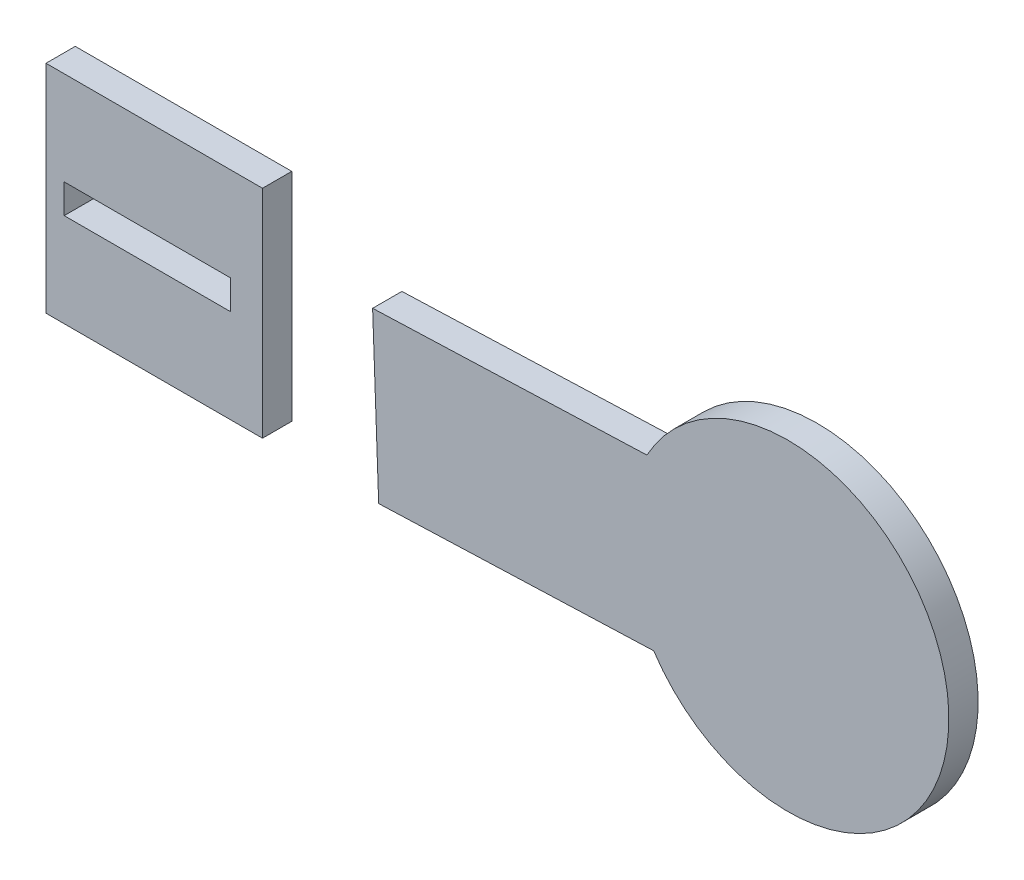
ISO-10303-21;
HEADER;
FILE_DESCRIPTION(('STEP AP214'),'2;1');
FILE_NAME('part.step','',(''),(''),'','','');
FILE_SCHEMA(('AUTOMOTIVE_DESIGN { 1 0 10303 214 1 1 1 1 }'));
ENDSEC;
DATA;
#1=APPLICATION_CONTEXT('core data for automotive mechanical design processes');
#2=APPLICATION_PROTOCOL_DEFINITION('international standard','automotive_design',2000,#1);
#3=PRODUCT_CONTEXT('',#1,'mechanical');
#4=PRODUCT('Part','Part','',(#3));
#5=PRODUCT_RELATED_PRODUCT_CATEGORY('part','',(#4));
#6=PRODUCT_DEFINITION_FORMATION('','',#4);
#7=PRODUCT_DEFINITION_CONTEXT('part definition',#1,'design');
#8=PRODUCT_DEFINITION('design','',#6,#7);
#9=PRODUCT_DEFINITION_SHAPE('','',#8);
#10=(LENGTH_UNIT() NAMED_UNIT(*) SI_UNIT(.MILLI.,.METRE.));
#11=(NAMED_UNIT(*) PLANE_ANGLE_UNIT() SI_UNIT($,.RADIAN.));
#12=(NAMED_UNIT(*) SI_UNIT($,.STERADIAN.) SOLID_ANGLE_UNIT());
#13=UNCERTAINTY_MEASURE_WITH_UNIT(LENGTH_MEASURE(1.E-05),#10,'distance_accuracy_value','');
#14=(GEOMETRIC_REPRESENTATION_CONTEXT(3) GLOBAL_UNCERTAINTY_ASSIGNED_CONTEXT((#13)) GLOBAL_UNIT_ASSIGNED_CONTEXT((#10,
#11,#12)) REPRESENTATION_CONTEXT('',''));
#15=CARTESIAN_POINT('',(0.,0.,0.));
#16=DIRECTION('',(0.,0.,1.));
#17=DIRECTION('',(1.,0.,0.));
#18=AXIS2_PLACEMENT_3D('',#15,#16,#17);
#19=CARTESIAN_POINT('',(-150.211759768994,12.0954604674431,0.));
#20=DIRECTION('',(1.,0.,0.));
#21=DIRECTION('',(0.,0.,-1.));
#22=AXIS2_PLACEMENT_3D('',#19,#20,#21);
#23=PLANE('',#22);
#24=DIRECTION('',(0.,1.,0.));
#25=VECTOR('',#24,1.);
#26=CARTESIAN_POINT('',(-150.211759768994,12.0954604674431,5.));
#27=LINE('',#26,#25);
#28=CARTESIAN_POINT('',(-150.211759768994,12.0954604674431,5.));
#29=VERTEX_POINT('',#28);
#30=CARTESIAN_POINT('',(-150.211759768994,49.0954604674431,5.));
#31=VERTEX_POINT('',#30);
#32=EDGE_CURVE('E140',#29,#31,#27,.T.);
#33=ORIENTED_EDGE('',*,*,#32,.F.);
#34=DIRECTION('',(0.,0.,1.));
#35=VECTOR('',#34,1.);
#36=CARTESIAN_POINT('',(-150.211759768994,12.0954604674431,0.));
#37=LINE('',#36,#35);
#38=CARTESIAN_POINT('',(-150.211759768994,12.0954604674431,0.));
#39=VERTEX_POINT('',#38);
#40=EDGE_CURVE('E12',#39,#29,#37,.T.);
#41=ORIENTED_EDGE('',*,*,#40,.F.);
#42=DIRECTION('',(0.,1.,0.));
#43=VECTOR('',#42,1.);
#44=CARTESIAN_POINT('',(-150.211759768994,12.0954604674431,0.));
#45=LINE('',#44,#43);
#46=CARTESIAN_POINT('',(-150.211759768994,49.0954604674431,0.));
#47=VERTEX_POINT('',#46);
#48=EDGE_CURVE('E144',#39,#47,#45,.T.);
#49=ORIENTED_EDGE('',*,*,#48,.T.);
#50=DIRECTION('',(0.,0.,1.));
#51=VECTOR('',#50,1.);
#52=CARTESIAN_POINT('',(-150.211759768994,49.0954604674431,0.));
#53=LINE('',#52,#51);
#54=EDGE_CURVE('E45',#47,#31,#53,.T.);
#55=ORIENTED_EDGE('',*,*,#54,.T.);
#56=EDGE_LOOP('',(#33,#41,#49,#55));
#57=FACE_BOUND('',#56,.T.);
#58=ADVANCED_FACE('F42',(#57),#23,.T.);
#59=CARTESIAN_POINT('',(-150.211759768994,12.0954604674431,0.));
#60=DIRECTION('',(0.,-1.,0.));
#61=DIRECTION('',(1.,0.,0.));
#62=AXIS2_PLACEMENT_3D('',#59,#60,#61);
#63=PLANE('',#62);
#64=DIRECTION('',(1.,0.,0.));
#65=VECTOR('',#64,1.);
#66=CARTESIAN_POINT('',(-150.211759768994,12.0954604674431,5.));
#67=LINE('',#66,#65);
#68=CARTESIAN_POINT('',(-187.211759768994,12.0954604674431,5.));
#69=VERTEX_POINT('',#68);
#70=EDGE_CURVE('E148',#69,#29,#67,.T.);
#71=ORIENTED_EDGE('',*,*,#70,.F.);
#72=DIRECTION('',(0.,0.,1.));
#73=VECTOR('',#72,1.);
#74=CARTESIAN_POINT('',(-187.211759768994,12.0954604674431,0.));
#75=LINE('',#74,#73);
#76=CARTESIAN_POINT('',(-187.211759768994,12.0954604674431,0.));
#77=VERTEX_POINT('',#76);
#78=EDGE_CURVE('E50',#77,#69,#75,.T.);
#79=ORIENTED_EDGE('',*,*,#78,.F.);
#80=DIRECTION('',(1.,0.,0.));
#81=VECTOR('',#80,1.);
#82=CARTESIAN_POINT('',(-150.211759768994,12.0954604674431,0.));
#83=LINE('',#82,#81);
#84=EDGE_CURVE('E154',#77,#39,#83,.T.);
#85=ORIENTED_EDGE('',*,*,#84,.T.);
#86=ORIENTED_EDGE('',*,*,#40,.T.);
#87=EDGE_LOOP('',(#71,#79,#85,#86));
#88=FACE_BOUND('',#87,.T.);
#89=ADVANCED_FACE('F180',(#88),#63,.T.);
#90=CARTESIAN_POINT('',(-187.211759768994,12.0954604674431,0.));
#91=DIRECTION('',(-1.,0.,0.));
#92=DIRECTION('',(0.,0.,1.));
#93=AXIS2_PLACEMENT_3D('',#90,#91,#92);
#94=PLANE('',#93);
#95=DIRECTION('',(0.,-1.,0.));
#96=VECTOR('',#95,1.);
#97=CARTESIAN_POINT('',(-187.211759768994,12.0954604674431,5.));
#98=LINE('',#97,#96);
#99=CARTESIAN_POINT('',(-187.211759768994,49.0954604674431,5.));
#100=VERTEX_POINT('',#99);
#101=EDGE_CURVE('E162',#100,#69,#98,.T.);
#102=ORIENTED_EDGE('',*,*,#101,.F.);
#103=DIRECTION('',(0.,0.,1.));
#104=VECTOR('',#103,1.);
#105=CARTESIAN_POINT('',(-187.211759768994,49.0954604674431,0.));
#106=LINE('',#105,#104);
#107=CARTESIAN_POINT('',(-187.211759768994,49.0954604674431,0.));
#108=VERTEX_POINT('',#107);
#109=EDGE_CURVE('E167',#108,#100,#106,.T.);
#110=ORIENTED_EDGE('',*,*,#109,.F.);
#111=DIRECTION('',(0.,-1.,0.));
#112=VECTOR('',#111,1.);
#113=CARTESIAN_POINT('',(-187.211759768994,12.0954604674431,0.));
#114=LINE('',#113,#112);
#115=EDGE_CURVE('E151',#108,#77,#114,.T.);
#116=ORIENTED_EDGE('',*,*,#115,.T.);
#117=ORIENTED_EDGE('',*,*,#78,.T.);
#118=EDGE_LOOP('',(#102,#110,#116,#117));
#119=FACE_BOUND('',#118,.T.);
#120=ADVANCED_FACE('F184',(#119),#94,.T.);
#121=CARTESIAN_POINT('',(-150.211759768994,49.0954604674431,0.));
#122=DIRECTION('',(0.,1.,0.));
#123=DIRECTION('',(-1.,0.,0.));
#124=AXIS2_PLACEMENT_3D('',#121,#122,#123);
#125=PLANE('',#124);
#126=DIRECTION('',(-1.,0.,0.));
#127=VECTOR('',#126,1.);
#128=CARTESIAN_POINT('',(-150.211759768994,49.0954604674431,5.));
#129=LINE('',#128,#127);
#130=EDGE_CURVE('E159',#31,#100,#129,.T.);
#131=ORIENTED_EDGE('',*,*,#130,.F.);
#132=ORIENTED_EDGE('',*,*,#54,.F.);
#133=DIRECTION('',(-1.,0.,0.));
#134=VECTOR('',#133,1.);
#135=CARTESIAN_POINT('',(-150.211759768994,49.0954604674431,0.));
#136=LINE('',#135,#134);
#137=EDGE_CURVE('E147',#47,#108,#136,.T.);
#138=ORIENTED_EDGE('',*,*,#137,.T.);
#139=ORIENTED_EDGE('',*,*,#109,.T.);
#140=EDGE_LOOP('',(#131,#132,#138,#139));
#141=FACE_BOUND('',#140,.T.);
#142=ADVANCED_FACE('F175',(#141),#125,.T.);
#143=CARTESIAN_POINT('',(0.,0.,0.));
#144=DIRECTION('',(0.,0.,1.));
#145=DIRECTION('',(1.,0.,0.));
#146=AXIS2_PLACEMENT_3D('',#143,#144,#145);
#147=PLANE('',#146);
#148=DIRECTION('',(1.,0.,0.));
#149=VECTOR('',#148,1.);
#150=CARTESIAN_POINT('',(-155.711759768994,28.0954604674431,0.));
#151=LINE('',#150,#149);
#152=CARTESIAN_POINT('',(-184.101842028994,28.0954604674431,0.));
#153=VERTEX_POINT('',#152);
#154=CARTESIAN_POINT('',(-155.711759768994,28.0954604674431,0.));
#155=VERTEX_POINT('',#154);
#156=EDGE_CURVE('E115',#153,#155,#151,.T.);
#157=ORIENTED_EDGE('',*,*,#156,.T.);
#158=DIRECTION('',(0.,1.,0.));
#159=VECTOR('',#158,1.);
#160=CARTESIAN_POINT('',(-155.711759768994,28.0954604674431,0.));
#161=LINE('',#160,#159);
#162=CARTESIAN_POINT('',(-155.711759768994,33.0954604674431,0.));
#163=VERTEX_POINT('',#162);
#164=EDGE_CURVE('E109',#155,#163,#161,.T.);
#165=ORIENTED_EDGE('',*,*,#164,.T.);
#166=DIRECTION('',(-1.,0.,0.));
#167=VECTOR('',#166,1.);
#168=CARTESIAN_POINT('',(-155.711759768994,33.0954604674431,0.));
#169=LINE('',#168,#167);
#170=CARTESIAN_POINT('',(-184.101842028994,33.0954604674431,0.));
#171=VERTEX_POINT('',#170);
#172=EDGE_CURVE('E118',#163,#171,#169,.T.);
#173=ORIENTED_EDGE('',*,*,#172,.T.);
#174=DIRECTION('',(0.,-1.,0.));
#175=VECTOR('',#174,1.);
#176=CARTESIAN_POINT('',(-184.101842028994,28.0954604674431,0.));
#177=LINE('',#176,#175);
#178=EDGE_CURVE('E58',#171,#153,#177,.T.);
#179=ORIENTED_EDGE('',*,*,#178,.T.);
#180=EDGE_LOOP('',(#157,#165,#173,#179));
#181=FACE_BOUND('',#180,.T.);
#182=ORIENTED_EDGE('',*,*,#48,.F.);
#183=ORIENTED_EDGE('',*,*,#84,.F.);
#184=ORIENTED_EDGE('',*,*,#115,.F.);
#185=ORIENTED_EDGE('',*,*,#137,.F.);
#186=EDGE_LOOP('',(#182,#183,#184,#185));
#187=FACE_BOUND('',#186,.T.);
#188=ADVANCED_FACE('F122',(#181,#187),#147,.F.);
#189=CARTESIAN_POINT('',(0.,0.,5.));
#190=DIRECTION('',(0.,0.,1.));
#191=DIRECTION('',(1.,0.,0.));
#192=AXIS2_PLACEMENT_3D('',#189,#190,#191);
#193=PLANE('',#192);
#194=DIRECTION('',(0.,1.,0.));
#195=VECTOR('',#194,1.);
#196=CARTESIAN_POINT('',(-155.711759768994,28.0954604674431,5.));
#197=LINE('',#196,#195);
#198=CARTESIAN_POINT('',(-155.711759768994,28.0954604674431,5.));
#199=VERTEX_POINT('',#198);
#200=CARTESIAN_POINT('',(-155.711759768994,33.0954604674431,5.));
#201=VERTEX_POINT('',#200);
#202=EDGE_CURVE('E66',#199,#201,#197,.T.);
#203=ORIENTED_EDGE('',*,*,#202,.F.);
#204=DIRECTION('',(1.,0.,0.));
#205=VECTOR('',#204,1.);
#206=CARTESIAN_POINT('',(-155.711759768994,28.0954604674431,5.));
#207=LINE('',#206,#205);
#208=CARTESIAN_POINT('',(-184.101842028994,28.0954604674431,5.));
#209=VERTEX_POINT('',#208);
#210=EDGE_CURVE('E125',#209,#199,#207,.T.);
#211=ORIENTED_EDGE('',*,*,#210,.F.);
#212=DIRECTION('',(0.,-1.,0.));
#213=VECTOR('',#212,1.);
#214=CARTESIAN_POINT('',(-184.101842028994,28.0954604674431,5.));
#215=LINE('',#214,#213);
#216=CARTESIAN_POINT('',(-184.101842028994,33.0954604674431,5.));
#217=VERTEX_POINT('',#216);
#218=EDGE_CURVE('E128',#217,#209,#215,.T.);
#219=ORIENTED_EDGE('',*,*,#218,.F.);
#220=DIRECTION('',(-1.,0.,0.));
#221=VECTOR('',#220,1.);
#222=CARTESIAN_POINT('',(-155.711759768994,33.0954604674431,5.));
#223=LINE('',#222,#221);
#224=EDGE_CURVE('E134',#201,#217,#223,.T.);
#225=ORIENTED_EDGE('',*,*,#224,.F.);
#226=EDGE_LOOP('',(#203,#211,#219,#225));
#227=FACE_BOUND('',#226,.T.);
#228=ORIENTED_EDGE('',*,*,#32,.T.);
#229=ORIENTED_EDGE('',*,*,#130,.T.);
#230=ORIENTED_EDGE('',*,*,#101,.T.);
#231=ORIENTED_EDGE('',*,*,#70,.T.);
#232=EDGE_LOOP('',(#228,#229,#230,#231));
#233=FACE_BOUND('',#232,.T.);
#234=ADVANCED_FACE('F177',(#227,#233),#193,.T.);
#235=CARTESIAN_POINT('',(-155.711759768994,28.0954604674431,0.));
#236=DIRECTION('',(1.,0.,0.));
#237=DIRECTION('',(0.,0.,-1.));
#238=AXIS2_PLACEMENT_3D('',#235,#236,#237);
#239=PLANE('',#238);
#240=ORIENTED_EDGE('',*,*,#202,.T.);
#241=DIRECTION('',(0.,0.,1.));
#242=VECTOR('',#241,1.);
#243=CARTESIAN_POINT('',(-155.711759768994,33.0954604674431,0.));
#244=LINE('',#243,#242);
#245=EDGE_CURVE('E105',#163,#201,#244,.T.);
#246=ORIENTED_EDGE('',*,*,#245,.F.);
#247=ORIENTED_EDGE('',*,*,#164,.F.);
#248=DIRECTION('',(0.,0.,1.));
#249=VECTOR('',#248,1.);
#250=CARTESIAN_POINT('',(-155.711759768994,28.0954604674431,0.));
#251=LINE('',#250,#249);
#252=EDGE_CURVE('E138',#155,#199,#251,.T.);
#253=ORIENTED_EDGE('',*,*,#252,.T.);
#254=EDGE_LOOP('',(#240,#246,#247,#253));
#255=FACE_BOUND('',#254,.T.);
#256=ADVANCED_FACE('F107',(#255),#239,.F.);
#257=CARTESIAN_POINT('',(-155.711759768994,28.0954604674431,0.));
#258=DIRECTION('',(0.,-1.,0.));
#259=DIRECTION('',(0.,0.,-1.));
#260=AXIS2_PLACEMENT_3D('',#257,#258,#259);
#261=PLANE('',#260);
#262=ORIENTED_EDGE('',*,*,#210,.T.);
#263=ORIENTED_EDGE('',*,*,#252,.F.);
#264=ORIENTED_EDGE('',*,*,#156,.F.);
#265=DIRECTION('',(0.,0.,1.));
#266=VECTOR('',#265,1.);
#267=CARTESIAN_POINT('',(-184.101842028994,28.0954604674431,0.));
#268=LINE('',#267,#266);
#269=EDGE_CURVE('E141',#153,#209,#268,.T.);
#270=ORIENTED_EDGE('',*,*,#269,.T.);
#271=EDGE_LOOP('',(#262,#263,#264,#270));
#272=FACE_BOUND('',#271,.T.);
#273=ADVANCED_FACE('F235',(#272),#261,.F.);
#274=CARTESIAN_POINT('',(-184.101842028994,28.0954604674431,0.));
#275=DIRECTION('',(-1.,0.,0.));
#276=DIRECTION('',(0.,0.,1.));
#277=AXIS2_PLACEMENT_3D('',#274,#275,#276);
#278=PLANE('',#277);
#279=ORIENTED_EDGE('',*,*,#218,.T.);
#280=ORIENTED_EDGE('',*,*,#269,.F.);
#281=ORIENTED_EDGE('',*,*,#178,.F.);
#282=DIRECTION('',(0.,0.,1.));
#283=VECTOR('',#282,1.);
#284=CARTESIAN_POINT('',(-184.101842028994,33.0954604674431,0.));
#285=LINE('',#284,#283);
#286=EDGE_CURVE('E114',#171,#217,#285,.T.);
#287=ORIENTED_EDGE('',*,*,#286,.T.);
#288=EDGE_LOOP('',(#279,#280,#281,#287));
#289=FACE_BOUND('',#288,.T.);
#290=ADVANCED_FACE('F244',(#289),#278,.F.);
#291=CARTESIAN_POINT('',(-155.711759768994,33.0954604674431,0.));
#292=DIRECTION('',(0.,1.,0.));
#293=DIRECTION('',(-1.,0.,0.));
#294=AXIS2_PLACEMENT_3D('',#291,#292,#293);
#295=PLANE('',#294);
#296=ORIENTED_EDGE('',*,*,#224,.T.);
#297=ORIENTED_EDGE('',*,*,#286,.F.);
#298=ORIENTED_EDGE('',*,*,#172,.F.);
#299=ORIENTED_EDGE('',*,*,#245,.T.);
#300=EDGE_LOOP('',(#296,#297,#298,#299));
#301=FACE_BOUND('',#300,.T.);
#302=ADVANCED_FACE('F119',(#301),#295,.F.);
#303=CLOSED_SHELL('',(#58,#89,#120,#142,#188,#234,#256,#273,#290,#302));
#304=MANIFOLD_SOLID_BREP('B2',#303);
#305=CARTESIAN_POINT('',(-60.4073074295923,29.21875,5.));
#306=DIRECTION('',(0.,0.,-1.));
#307=DIRECTION('',(-1.,0.,0.));
#308=AXIS2_PLACEMENT_3D('',#305,#306,#307);
#309=CYLINDRICAL_SURFACE('',#308,27.5);
#310=CARTESIAN_POINT('',(-60.4073074295923,29.21875,5.));
#311=DIRECTION('',(0.,0.,1.));
#312=DIRECTION('',(1.,0.,0.));
#313=AXIS2_PLACEMENT_3D('',#310,#311,#312);
#314=CIRCLE('',#313,27.5);
#315=CARTESIAN_POINT('',(-83.3549017296973,14.0642814894324,5.));
#316=VERTEX_POINT('',#315);
#317=CARTESIAN_POINT('',(-84.5151574075595,42.4498334567629,5.));
#318=VERTEX_POINT('',#317);
#319=EDGE_CURVE('E40',#316,#318,#314,.T.);
#320=ORIENTED_EDGE('',*,*,#319,.F.);
#321=DIRECTION('',(0.,0.,1.));
#322=VECTOR('',#321,1.);
#323=CARTESIAN_POINT('',(-83.3549017296973,14.0642814894324,0.));
#324=LINE('',#323,#322);
#325=CARTESIAN_POINT('',(-83.3549017296973,14.0642814894324,0.));
#326=VERTEX_POINT('',#325);
#327=EDGE_CURVE('E339',#326,#316,#324,.T.);
#328=ORIENTED_EDGE('',*,*,#327,.F.);
#329=CARTESIAN_POINT('',(-60.4073074295923,29.21875,0.));
#330=DIRECTION('',(0.,0.,1.));
#331=DIRECTION('',(1.,0.,0.));
#332=AXIS2_PLACEMENT_3D('',#329,#330,#331);
#333=CIRCLE('',#332,27.5);
#334=CARTESIAN_POINT('',(-84.5151574075595,42.4498334567629,0.));
#335=VERTEX_POINT('',#334);
#336=EDGE_CURVE('E274',#326,#335,#333,.T.);
#337=ORIENTED_EDGE('',*,*,#336,.T.);
#338=DIRECTION('',(0.,0.,1.));
#339=VECTOR('',#338,1.);
#340=CARTESIAN_POINT('',(-84.5151574075595,42.4498334567629,0.));
#341=LINE('',#340,#339);
#342=EDGE_CURVE('E315',#335,#318,#341,.T.);
#343=ORIENTED_EDGE('',*,*,#342,.T.);
#344=EDGE_LOOP('',(#320,#328,#337,#343));
#345=FACE_BOUND('',#344,.T.);
#346=ADVANCED_FACE('F271',(#345),#309,.T.);
#347=CARTESIAN_POINT('',(-60.4073074295923,29.21875,5.));
#348=DIRECTION('',(0.,0.,1.));
#349=DIRECTION('',(1.,0.,0.));
#350=AXIS2_PLACEMENT_3D('',#347,#348,#349);
#351=PLANE('',#350);
#352=ORIENTED_EDGE('',*,*,#319,.T.);
#353=DIRECTION('',(-0.99933468546631,-0.0364717208800319,0.));
#354=VECTOR('',#353,1.);
#355=CARTESIAN_POINT('',(-84.5151574075595,42.4498334567629,5.));
#356=LINE('',#355,#354);
#357=CARTESIAN_POINT('',(-131.391026234297,40.7390516449017,5.));
#358=VERTEX_POINT('',#357);
#359=EDGE_CURVE('E336',#318,#358,#356,.T.);
#360=ORIENTED_EDGE('',*,*,#359,.T.);
#361=DIRECTION('',(0.0364717208800316,-0.99933468546631,0.));
#362=VECTOR('',#361,1.);
#363=CARTESIAN_POINT('',(-130.354901729697,12.3489693859987,5.));
#364=LINE('',#363,#362);
#365=CARTESIAN_POINT('',(-130.354901729697,12.3489693859987,5.));
#366=VERTEX_POINT('',#365);
#367=EDGE_CURVE('E322',#358,#366,#364,.T.);
#368=ORIENTED_EDGE('',*,*,#367,.T.);
#369=DIRECTION('',(0.99933468546631,0.0364717208800317,0.));
#370=VECTOR('',#369,1.);
#371=CARTESIAN_POINT('',(-83.3549017296973,14.0642814894324,5.));
#372=LINE('',#371,#370);
#373=EDGE_CURVE('E284',#366,#316,#372,.T.);
#374=ORIENTED_EDGE('',*,*,#373,.T.);
#375=EDGE_LOOP('',(#352,#360,#368,#374));
#376=FACE_BOUND('',#375,.T.);
#377=ADVANCED_FACE('F344',(#376),#351,.T.);
#378=CARTESIAN_POINT('',(-60.4073074295923,29.21875,0.));
#379=DIRECTION('',(0.,0.,1.));
#380=DIRECTION('',(1.,0.,0.));
#381=AXIS2_PLACEMENT_3D('',#378,#379,#380);
#382=PLANE('',#381);
#383=ORIENTED_EDGE('',*,*,#336,.F.);
#384=DIRECTION('',(0.99933468546631,0.0364717208800317,0.));
#385=VECTOR('',#384,1.);
#386=CARTESIAN_POINT('',(-83.3549017296973,14.0642814894324,0.));
#387=LINE('',#386,#385);
#388=CARTESIAN_POINT('',(-130.354901729697,12.3489693859987,0.));
#389=VERTEX_POINT('',#388);
#390=EDGE_CURVE('E292',#389,#326,#387,.T.);
#391=ORIENTED_EDGE('',*,*,#390,.F.);
#392=DIRECTION('',(0.0364717208800316,-0.99933468546631,0.));
#393=VECTOR('',#392,1.);
#394=CARTESIAN_POINT('',(-130.354901729697,12.3489693859987,0.));
#395=LINE('',#394,#393);
#396=CARTESIAN_POINT('',(-131.391026234297,40.7390516449017,0.));
#397=VERTEX_POINT('',#396);
#398=EDGE_CURVE('E321',#397,#389,#395,.T.);
#399=ORIENTED_EDGE('',*,*,#398,.F.);
#400=DIRECTION('',(-0.99933468546631,-0.0364717208800319,0.));
#401=VECTOR('',#400,1.);
#402=CARTESIAN_POINT('',(-84.5151574075595,42.4498334567629,0.));
#403=LINE('',#402,#401);
#404=EDGE_CURVE('E328',#335,#397,#403,.T.);
#405=ORIENTED_EDGE('',*,*,#404,.F.);
#406=EDGE_LOOP('',(#383,#391,#399,#405));
#407=FACE_BOUND('',#406,.T.);
#408=ADVANCED_FACE('F327',(#407),#382,.F.);
#409=CARTESIAN_POINT('',(-83.3549017296973,14.0642814894324,0.));
#410=DIRECTION('',(0.0364717208800317,-0.99933468546631,0.));
#411=DIRECTION('',(0.99933468546631,0.0364717208800317,0.));
#412=AXIS2_PLACEMENT_3D('',#409,#410,#411);
#413=PLANE('',#412);
#414=ORIENTED_EDGE('',*,*,#373,.F.);
#415=DIRECTION('',(0.,0.,1.));
#416=VECTOR('',#415,1.);
#417=CARTESIAN_POINT('',(-130.354901729697,12.3489693859987,0.));
#418=LINE('',#417,#416);
#419=EDGE_CURVE('E309',#389,#366,#418,.T.);
#420=ORIENTED_EDGE('',*,*,#419,.F.);
#421=ORIENTED_EDGE('',*,*,#390,.T.);
#422=ORIENTED_EDGE('',*,*,#327,.T.);
#423=EDGE_LOOP('',(#414,#420,#421,#422));
#424=FACE_BOUND('',#423,.T.);
#425=ADVANCED_FACE('F345',(#424),#413,.T.);
#426=CARTESIAN_POINT('',(-130.354901729697,12.3489693859987,0.));
#427=DIRECTION('',(-0.99933468546631,-0.0364717208800316,0.));
#428=DIRECTION('',(0.0364717208800316,-0.99933468546631,0.));
#429=AXIS2_PLACEMENT_3D('',#426,#427,#428);
#430=PLANE('',#429);
#431=ORIENTED_EDGE('',*,*,#367,.F.);
#432=DIRECTION('',(0.,0.,1.));
#433=VECTOR('',#432,1.);
#434=CARTESIAN_POINT('',(-131.391026234297,40.7390516449017,0.));
#435=LINE('',#434,#433);
#436=EDGE_CURVE('E318',#397,#358,#435,.T.);
#437=ORIENTED_EDGE('',*,*,#436,.F.);
#438=ORIENTED_EDGE('',*,*,#398,.T.);
#439=ORIENTED_EDGE('',*,*,#419,.T.);
#440=EDGE_LOOP('',(#431,#437,#438,#439));
#441=FACE_BOUND('',#440,.T.);
#442=ADVANCED_FACE('F320',(#441),#430,.T.);
#443=CARTESIAN_POINT('',(-84.5151574075595,42.4498334567629,0.));
#444=DIRECTION('',(-0.0364717208800319,0.99933468546631,0.));
#445=DIRECTION('',(-0.99933468546631,-0.0364717208800319,0.));
#446=AXIS2_PLACEMENT_3D('',#443,#444,#445);
#447=PLANE('',#446);
#448=ORIENTED_EDGE('',*,*,#359,.F.);
#449=ORIENTED_EDGE('',*,*,#342,.F.);
#450=ORIENTED_EDGE('',*,*,#404,.T.);
#451=ORIENTED_EDGE('',*,*,#436,.T.);
#452=EDGE_LOOP('',(#448,#449,#450,#451));
#453=FACE_BOUND('',#452,.T.);
#454=ADVANCED_FACE('F331',(#453),#447,.T.);
#455=CLOSED_SHELL('',(#346,#377,#408,#425,#442,#454));
#456=MANIFOLD_SOLID_BREP('B6',#455);
#457=ADVANCED_BREP_SHAPE_REPRESENTATION('',(#18,#304,#456),#14);
#458=SHAPE_DEFINITION_REPRESENTATION(#9,#457);
ENDSEC;
END-ISO-10303-21;
